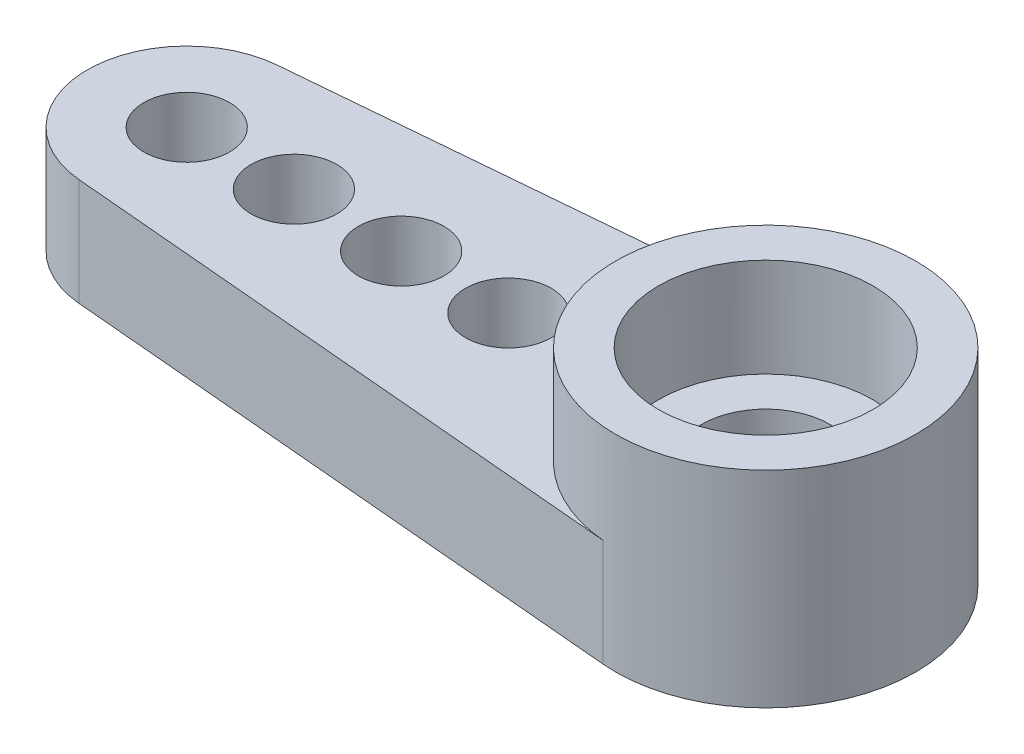
ISO-10303-21;
HEADER;
FILE_DESCRIPTION(('STEP AP214'),'2;1');
FILE_NAME('part.step','',(''),(''),'','','');
FILE_SCHEMA(('AUTOMOTIVE_DESIGN { 1 0 10303 214 1 1 1 1 }'));
ENDSEC;
DATA;
#1=APPLICATION_CONTEXT('core data for automotive mechanical design processes');
#2=APPLICATION_PROTOCOL_DEFINITION('international standard','automotive_design',2000,#1);
#3=PRODUCT_CONTEXT('',#1,'mechanical');
#4=PRODUCT('Part','Part','',(#3));
#5=PRODUCT_RELATED_PRODUCT_CATEGORY('part','',(#4));
#6=PRODUCT_DEFINITION_FORMATION('','',#4);
#7=PRODUCT_DEFINITION_CONTEXT('part definition',#1,'design');
#8=PRODUCT_DEFINITION('design','',#6,#7);
#9=PRODUCT_DEFINITION_SHAPE('','',#8);
#10=(LENGTH_UNIT() NAMED_UNIT(*) SI_UNIT(.MILLI.,.METRE.));
#11=(NAMED_UNIT(*) PLANE_ANGLE_UNIT() SI_UNIT($,.RADIAN.));
#12=(NAMED_UNIT(*) SI_UNIT($,.STERADIAN.) SOLID_ANGLE_UNIT());
#13=UNCERTAINTY_MEASURE_WITH_UNIT(LENGTH_MEASURE(1.E-05),#10,'distance_accuracy_value','');
#14=(GEOMETRIC_REPRESENTATION_CONTEXT(3) GLOBAL_UNCERTAINTY_ASSIGNED_CONTEXT((#13)) GLOBAL_UNIT_ASSIGNED_CONTEXT((#10,
#11,#12)) REPRESENTATION_CONTEXT('',''));
#15=CARTESIAN_POINT('',(0.,0.,0.));
#16=DIRECTION('',(0.,0.,1.));
#17=DIRECTION('',(1.,0.,0.));
#18=AXIS2_PLACEMENT_3D('',#15,#16,#17);
#19=CARTESIAN_POINT('',(0.,4.8,0.));
#20=DIRECTION('',(0.,-1.,0.));
#21=DIRECTION('',(0.,0.,-1.));
#22=AXIS2_PLACEMENT_3D('',#19,#20,#21);
#23=CYLINDRICAL_SURFACE('',#22,2.5);
#24=CARTESIAN_POINT('',(0.,4.8,0.));
#25=DIRECTION('',(0.,1.,0.));
#26=DIRECTION('',(0.,0.,1.));
#27=AXIS2_PLACEMENT_3D('',#24,#25,#26);
#28=CIRCLE('',#27,2.5);
#29=CARTESIAN_POINT('',(0.,4.8,2.5));
#30=VERTEX_POINT('',#29);
#31=EDGE_CURVE('E121',#30,#30,#28,.T.);
#32=ORIENTED_EDGE('',*,*,#31,.T.);
#33=EDGE_LOOP('',(#32));
#34=FACE_BOUND('',#33,.T.);
#35=CARTESIAN_POINT('',(0.,2.5,0.));
#36=DIRECTION('',(0.,-1.,0.));
#37=DIRECTION('',(0.,0.,-1.));
#38=AXIS2_PLACEMENT_3D('',#35,#36,#37);
#39=CIRCLE('',#38,2.5);
#40=CARTESIAN_POINT('',(0.,2.5,-2.5));
#41=VERTEX_POINT('',#40);
#42=EDGE_CURVE('E44',#41,#41,#39,.T.);
#43=ORIENTED_EDGE('',*,*,#42,.T.);
#44=EDGE_LOOP('',(#43));
#45=FACE_BOUND('',#44,.T.);
#46=ADVANCED_FACE('F40',(#34,#45),#23,.F.);
#47=CARTESIAN_POINT('',(0.,4.8,0.));
#48=DIRECTION('',(0.,1.,0.));
#49=DIRECTION('',(0.,0.,1.));
#50=AXIS2_PLACEMENT_3D('',#47,#48,#49);
#51=PLANE('',#50);
#52=CARTESIAN_POINT('',(0.,4.8,0.));
#53=DIRECTION('',(0.,1.,0.));
#54=DIRECTION('',(0.,0.,1.));
#55=AXIS2_PLACEMENT_3D('',#52,#53,#54);
#56=CIRCLE('',#55,3.5);
#57=CARTESIAN_POINT('',(0.,4.8,3.5));
#58=VERTEX_POINT('',#57);
#59=EDGE_CURVE('E11',#58,#58,#56,.T.);
#60=ORIENTED_EDGE('',*,*,#59,.T.);
#61=EDGE_LOOP('',(#60));
#62=FACE_BOUND('',#61,.T.);
#63=ORIENTED_EDGE('',*,*,#31,.F.);
#64=EDGE_LOOP('',(#63));
#65=FACE_BOUND('',#64,.T.);
#66=ADVANCED_FACE('F141',(#62,#65),#51,.T.);
#67=CARTESIAN_POINT('',(0.,0.,0.));
#68=DIRECTION('',(0.,1.,0.));
#69=DIRECTION('',(0.,0.,1.));
#70=AXIS2_PLACEMENT_3D('',#67,#68,#69);
#71=PLANE('',#70);
#72=CARTESIAN_POINT('',(0.,0.,0.));
#73=DIRECTION('',(0.,1.,0.));
#74=DIRECTION('',(0.,0.,1.));
#75=AXIS2_PLACEMENT_3D('',#72,#73,#74);
#76=CIRCLE('',#75,3.5);
#77=CARTESIAN_POINT('',(-0.305925925925926,0.,3.48660426889063));
#78=VERTEX_POINT('',#77);
#79=CARTESIAN_POINT('',(-0.305925925925926,0.,-3.48660426889063));
#80=VERTEX_POINT('',#79);
#81=EDGE_CURVE('E49',#78,#80,#76,.T.);
#82=ORIENTED_EDGE('',*,*,#81,.F.);
#83=DIRECTION('',(-0.996172648254466,0.,-0.0874074074074076));
#84=VECTOR('',#83,1.);
#85=CARTESIAN_POINT('',(-13.7027851851852,0.,2.31112054395036));
#86=LINE('',#85,#84);
#87=CARTESIAN_POINT('',(-13.7027851851852,0.,2.31112054395036));
#88=VERTEX_POINT('',#87);
#89=EDGE_CURVE('E103',#78,#88,#86,.T.);
#90=ORIENTED_EDGE('',*,*,#89,.T.);
#91=CARTESIAN_POINT('',(-13.5,0.,0.));
#92=DIRECTION('',(0.,-1.,0.));
#93=DIRECTION('',(0.,0.,-1.));
#94=AXIS2_PLACEMENT_3D('',#91,#92,#93);
#95=CIRCLE('',#94,2.32);
#96=CARTESIAN_POINT('',(-13.7027851851852,0.,-2.31112054395036));
#97=VERTEX_POINT('',#96);
#98=EDGE_CURVE('E112',#88,#97,#95,.T.);
#99=ORIENTED_EDGE('',*,*,#98,.T.);
#100=DIRECTION('',(0.996172648254466,0.,-0.0874074074074073));
#101=VECTOR('',#100,1.);
#102=CARTESIAN_POINT('',(-13.7027851851852,0.,-2.31112054395036));
#103=LINE('',#102,#101);
#104=EDGE_CURVE('E87',#97,#80,#103,.T.);
#105=ORIENTED_EDGE('',*,*,#104,.T.);
#106=EDGE_LOOP('',(#82,#90,#99,#105));
#107=FACE_BOUND('',#106,.T.);
#108=CARTESIAN_POINT('',(0.,0.,0.));
#109=DIRECTION('',(0.,-1.,0.));
#110=DIRECTION('',(0.,0.,-1.));
#111=AXIS2_PLACEMENT_3D('',#108,#109,#110);
#112=CIRCLE('',#111,1.5);
#113=CARTESIAN_POINT('',(0.,0.,-1.5));
#114=VERTEX_POINT('',#113);
#115=EDGE_CURVE('E108',#114,#114,#112,.T.);
#116=ORIENTED_EDGE('',*,*,#115,.F.);
#117=EDGE_LOOP('',(#116));
#118=FACE_BOUND('',#117,.T.);
#119=CARTESIAN_POINT('',(-6.,0.,0.));
#120=DIRECTION('',(0.,-1.,0.));
#121=DIRECTION('',(0.,0.,-1.));
#122=AXIS2_PLACEMENT_3D('',#119,#120,#121);
#123=CIRCLE('',#122,1.);
#124=CARTESIAN_POINT('',(-6.,0.,-1.));
#125=VERTEX_POINT('',#124);
#126=EDGE_CURVE('E205',#125,#125,#123,.T.);
#127=ORIENTED_EDGE('',*,*,#126,.F.);
#128=EDGE_LOOP('',(#127));
#129=FACE_BOUND('',#128,.T.);
#130=CARTESIAN_POINT('',(-8.5,0.,0.));
#131=DIRECTION('',(0.,-1.,0.));
#132=DIRECTION('',(0.,0.,-1.));
#133=AXIS2_PLACEMENT_3D('',#130,#131,#132);
#134=CIRCLE('',#133,1.);
#135=CARTESIAN_POINT('',(-8.5,0.,-1.));
#136=VERTEX_POINT('',#135);
#137=EDGE_CURVE('E209',#136,#136,#134,.T.);
#138=ORIENTED_EDGE('',*,*,#137,.F.);
#139=EDGE_LOOP('',(#138));
#140=FACE_BOUND('',#139,.T.);
#141=CARTESIAN_POINT('',(-11.,0.,0.));
#142=DIRECTION('',(0.,-1.,0.));
#143=DIRECTION('',(0.,0.,-1.));
#144=AXIS2_PLACEMENT_3D('',#141,#142,#143);
#145=CIRCLE('',#144,1.);
#146=CARTESIAN_POINT('',(-11.,0.,-1.));
#147=VERTEX_POINT('',#146);
#148=EDGE_CURVE('E196',#147,#147,#145,.T.);
#149=ORIENTED_EDGE('',*,*,#148,.F.);
#150=EDGE_LOOP('',(#149));
#151=FACE_BOUND('',#150,.T.);
#152=CARTESIAN_POINT('',(-13.5,0.,0.));
#153=DIRECTION('',(0.,-1.,0.));
#154=DIRECTION('',(0.,0.,-1.));
#155=AXIS2_PLACEMENT_3D('',#152,#153,#154);
#156=CIRCLE('',#155,1.);
#157=CARTESIAN_POINT('',(-13.5,0.,-1.));
#158=VERTEX_POINT('',#157);
#159=EDGE_CURVE('E190',#158,#158,#156,.T.);
#160=ORIENTED_EDGE('',*,*,#159,.F.);
#161=EDGE_LOOP('',(#160));
#162=FACE_BOUND('',#161,.T.);
#163=ADVANCED_FACE('F126',(#107,#118,#129,#140,#151,#162),#71,.F.);
#164=CARTESIAN_POINT('',(0.,4.8,0.));
#165=DIRECTION('',(0.,-1.,0.));
#166=DIRECTION('',(0.,0.,-1.));
#167=AXIS2_PLACEMENT_3D('',#164,#165,#166);
#168=CYLINDRICAL_SURFACE('',#167,3.5);
#169=DIRECTION('',(0.,-1.,0.));
#170=VECTOR('',#169,1.);
#171=CARTESIAN_POINT('',(-0.305925925925927,2.5,-3.48660426889063));
#172=LINE('',#171,#170);
#173=CARTESIAN_POINT('',(-0.305925925925927,2.5,-3.48660426889063));
#174=VERTEX_POINT('',#173);
#175=EDGE_CURVE('E62',#174,#80,#172,.T.);
#176=ORIENTED_EDGE('',*,*,#175,.F.);
#177=CARTESIAN_POINT('',(0.,2.5,0.));
#178=DIRECTION('',(0.,-1.,0.));
#179=DIRECTION('',(0.,0.,-1.));
#180=AXIS2_PLACEMENT_3D('',#177,#178,#179);
#181=CIRCLE('',#180,3.5);
#182=CARTESIAN_POINT('',(-0.305925925925926,2.5,3.48660426889063));
#183=VERTEX_POINT('',#182);
#184=EDGE_CURVE('E57',#183,#174,#181,.T.);
#185=ORIENTED_EDGE('',*,*,#184,.F.);
#186=DIRECTION('',(0.,-1.,0.));
#187=VECTOR('',#186,1.);
#188=CARTESIAN_POINT('',(-0.305925925925926,2.5,3.48660426889063));
#189=LINE('',#188,#187);
#190=EDGE_CURVE('E117',#183,#78,#189,.T.);
#191=ORIENTED_EDGE('',*,*,#190,.T.);
#192=ORIENTED_EDGE('',*,*,#81,.T.);
#193=EDGE_LOOP('',(#176,#185,#191,#192));
#194=FACE_BOUND('',#193,.T.);
#195=ORIENTED_EDGE('',*,*,#59,.F.);
#196=EDGE_LOOP('',(#195));
#197=FACE_BOUND('',#196,.T.);
#198=ADVANCED_FACE('F42',(#194,#197),#168,.T.);
#199=CARTESIAN_POINT('',(-13.5,2.5,0.));
#200=DIRECTION('',(0.,-1.,0.));
#201=DIRECTION('',(0.,0.,-1.));
#202=AXIS2_PLACEMENT_3D('',#199,#200,#201);
#203=PLANE('',#202);
#204=CARTESIAN_POINT('',(0.,2.5,0.));
#205=DIRECTION('',(0.,-1.,0.));
#206=DIRECTION('',(0.,0.,-1.));
#207=AXIS2_PLACEMENT_3D('',#204,#205,#206);
#208=CIRCLE('',#207,1.5);
#209=CARTESIAN_POINT('',(0.,2.5,-1.5));
#210=VERTEX_POINT('',#209);
#211=EDGE_CURVE('E114',#210,#210,#208,.T.);
#212=ORIENTED_EDGE('',*,*,#211,.T.);
#213=EDGE_LOOP('',(#212));
#214=FACE_BOUND('',#213,.T.);
#215=ORIENTED_EDGE('',*,*,#42,.F.);
#216=EDGE_LOOP('',(#215));
#217=FACE_BOUND('',#216,.T.);
#218=ADVANCED_FACE('F154',(#214,#217),#203,.F.);
#219=CARTESIAN_POINT('',(0.,2.5,0.));
#220=DIRECTION('',(0.,-1.,0.));
#221=DIRECTION('',(0.,0.,-1.));
#222=AXIS2_PLACEMENT_3D('',#219,#220,#221);
#223=CYLINDRICAL_SURFACE('',#222,1.5);
#224=ORIENTED_EDGE('',*,*,#211,.F.);
#225=EDGE_LOOP('',(#224));
#226=FACE_BOUND('',#225,.T.);
#227=ORIENTED_EDGE('',*,*,#115,.T.);
#228=EDGE_LOOP('',(#227));
#229=FACE_BOUND('',#228,.T.);
#230=ADVANCED_FACE('F137',(#226,#229),#223,.F.);
#231=CARTESIAN_POINT('',(-13.5,2.5,0.));
#232=DIRECTION('',(0.,-1.,0.));
#233=DIRECTION('',(0.,0.,-1.));
#234=AXIS2_PLACEMENT_3D('',#231,#232,#233);
#235=CYLINDRICAL_SURFACE('',#234,2.32);
#236=ORIENTED_EDGE('',*,*,#98,.F.);
#237=DIRECTION('',(0.,-1.,0.));
#238=VECTOR('',#237,1.);
#239=CARTESIAN_POINT('',(-13.7027851851852,2.5,2.31112054395036));
#240=LINE('',#239,#238);
#241=CARTESIAN_POINT('',(-13.7027851851852,2.5,2.31112054395036));
#242=VERTEX_POINT('',#241);
#243=EDGE_CURVE('E102',#242,#88,#240,.T.);
#244=ORIENTED_EDGE('',*,*,#243,.F.);
#245=CARTESIAN_POINT('',(-13.5,2.5,0.));
#246=DIRECTION('',(0.,-1.,0.));
#247=DIRECTION('',(0.,0.,-1.));
#248=AXIS2_PLACEMENT_3D('',#245,#246,#247);
#249=CIRCLE('',#248,2.32);
#250=CARTESIAN_POINT('',(-13.7027851851852,2.5,-2.31112054395036));
#251=VERTEX_POINT('',#250);
#252=EDGE_CURVE('E98',#242,#251,#249,.T.);
#253=ORIENTED_EDGE('',*,*,#252,.T.);
#254=DIRECTION('',(0.,-1.,0.));
#255=VECTOR('',#254,1.);
#256=CARTESIAN_POINT('',(-13.7027851851852,2.5,-2.31112054395036));
#257=LINE('',#256,#255);
#258=EDGE_CURVE('E82',#251,#97,#257,.T.);
#259=ORIENTED_EDGE('',*,*,#258,.T.);
#260=EDGE_LOOP('',(#236,#244,#253,#259));
#261=FACE_BOUND('',#260,.T.);
#262=ADVANCED_FACE('F101',(#261),#235,.T.);
#263=CARTESIAN_POINT('',(-13.7027851851852,2.5,2.31112054395036));
#264=DIRECTION('',(-0.0874074074074076,0.,0.996172648254466));
#265=DIRECTION('',(0.996172648254466,0.,0.0874074074074076));
#266=AXIS2_PLACEMENT_3D('',#263,#264,#265);
#267=PLANE('',#266);
#268=ORIENTED_EDGE('',*,*,#89,.F.);
#269=ORIENTED_EDGE('',*,*,#190,.F.);
#270=DIRECTION('',(-0.996172648254466,0.,-0.0874074074074076));
#271=VECTOR('',#270,1.);
#272=CARTESIAN_POINT('',(-13.7027851851852,2.5,2.31112054395036));
#273=LINE('',#272,#271);
#274=EDGE_CURVE('E92',#183,#242,#273,.T.);
#275=ORIENTED_EDGE('',*,*,#274,.T.);
#276=ORIENTED_EDGE('',*,*,#243,.T.);
#277=EDGE_LOOP('',(#268,#269,#275,#276));
#278=FACE_BOUND('',#277,.T.);
#279=ADVANCED_FACE('F129',(#278),#267,.T.);
#280=CARTESIAN_POINT('',(-13.7027851851852,2.5,-2.31112054395036));
#281=DIRECTION('',(-0.0874074074074073,0.,-0.996172648254466));
#282=DIRECTION('',(-0.996172648254466,0.,0.0874074074074073));
#283=AXIS2_PLACEMENT_3D('',#280,#281,#282);
#284=PLANE('',#283);
#285=ORIENTED_EDGE('',*,*,#104,.F.);
#286=ORIENTED_EDGE('',*,*,#258,.F.);
#287=DIRECTION('',(0.996172648254466,0.,-0.0874074074074073));
#288=VECTOR('',#287,1.);
#289=CARTESIAN_POINT('',(-13.7027851851852,2.5,-2.31112054395036));
#290=LINE('',#289,#288);
#291=EDGE_CURVE('E85',#251,#174,#290,.T.);
#292=ORIENTED_EDGE('',*,*,#291,.T.);
#293=ORIENTED_EDGE('',*,*,#175,.T.);
#294=EDGE_LOOP('',(#285,#286,#292,#293));
#295=FACE_BOUND('',#294,.T.);
#296=ADVANCED_FACE('F84',(#295),#284,.T.);
#297=CARTESIAN_POINT('',(-6.,2.5,0.));
#298=DIRECTION('',(0.,-1.,0.));
#299=DIRECTION('',(0.,0.,-1.));
#300=AXIS2_PLACEMENT_3D('',#297,#298,#299);
#301=CIRCLE('',#300,1.);
#302=CARTESIAN_POINT('',(-6.,2.5,-1.));
#303=VERTEX_POINT('',#302);
#304=EDGE_CURVE('E178',#303,#303,#301,.T.);
#305=ORIENTED_EDGE('',*,*,#304,.T.);
#306=EDGE_LOOP('',(#305));
#307=FACE_BOUND('',#306,.T.);
#308=CARTESIAN_POINT('',(-8.5,2.5,0.));
#309=DIRECTION('',(0.,-1.,0.));
#310=DIRECTION('',(0.,0.,-1.));
#311=AXIS2_PLACEMENT_3D('',#308,#309,#310);
#312=CIRCLE('',#311,1.);
#313=CARTESIAN_POINT('',(-8.5,2.5,-1.));
#314=VERTEX_POINT('',#313);
#315=EDGE_CURVE('E182',#314,#314,#312,.T.);
#316=ORIENTED_EDGE('',*,*,#315,.T.);
#317=EDGE_LOOP('',(#316));
#318=FACE_BOUND('',#317,.T.);
#319=CARTESIAN_POINT('',(-11.,2.5,0.));
#320=DIRECTION('',(0.,-1.,0.));
#321=DIRECTION('',(0.,0.,-1.));
#322=AXIS2_PLACEMENT_3D('',#319,#320,#321);
#323=CIRCLE('',#322,1.);
#324=CARTESIAN_POINT('',(-11.,2.5,-1.));
#325=VERTEX_POINT('',#324);
#326=EDGE_CURVE('E186',#325,#325,#323,.T.);
#327=ORIENTED_EDGE('',*,*,#326,.T.);
#328=EDGE_LOOP('',(#327));
#329=FACE_BOUND('',#328,.T.);
#330=CARTESIAN_POINT('',(-13.5,2.5,0.));
#331=DIRECTION('',(0.,-1.,0.));
#332=DIRECTION('',(0.,0.,-1.));
#333=AXIS2_PLACEMENT_3D('',#330,#331,#332);
#334=CIRCLE('',#333,1.);
#335=CARTESIAN_POINT('',(-13.5,2.5,-1.));
#336=VERTEX_POINT('',#335);
#337=EDGE_CURVE('E189',#336,#336,#334,.T.);
#338=ORIENTED_EDGE('',*,*,#337,.T.);
#339=EDGE_LOOP('',(#338));
#340=FACE_BOUND('',#339,.T.);
#341=ORIENTED_EDGE('',*,*,#274,.F.);
#342=ORIENTED_EDGE('',*,*,#184,.T.);
#343=ORIENTED_EDGE('',*,*,#291,.F.);
#344=ORIENTED_EDGE('',*,*,#252,.F.);
#345=EDGE_LOOP('',(#341,#342,#343,#344));
#346=FACE_BOUND('',#345,.T.);
#347=ADVANCED_FACE('F97',(#307,#318,#329,#340,#346),#203,.F.);
#348=CARTESIAN_POINT('',(-13.5,2.5,0.));
#349=DIRECTION('',(0.,-1.,0.));
#350=DIRECTION('',(0.,0.,-1.));
#351=AXIS2_PLACEMENT_3D('',#348,#349,#350);
#352=CYLINDRICAL_SURFACE('',#351,1.);
#353=ORIENTED_EDGE('',*,*,#337,.F.);
#354=EDGE_LOOP('',(#353));
#355=FACE_BOUND('',#354,.T.);
#356=ORIENTED_EDGE('',*,*,#159,.T.);
#357=EDGE_LOOP('',(#356));
#358=FACE_BOUND('',#357,.T.);
#359=ADVANCED_FACE('F167',(#355,#358),#352,.F.);
#360=CARTESIAN_POINT('',(-11.,2.5,0.));
#361=DIRECTION('',(0.,-1.,0.));
#362=DIRECTION('',(0.,0.,-1.));
#363=AXIS2_PLACEMENT_3D('',#360,#361,#362);
#364=CYLINDRICAL_SURFACE('',#363,1.);
#365=ORIENTED_EDGE('',*,*,#326,.F.);
#366=EDGE_LOOP('',(#365));
#367=FACE_BOUND('',#366,.T.);
#368=ORIENTED_EDGE('',*,*,#148,.T.);
#369=EDGE_LOOP('',(#368));
#370=FACE_BOUND('',#369,.T.);
#371=ADVANCED_FACE('F172',(#367,#370),#364,.F.);
#372=CARTESIAN_POINT('',(-8.5,2.5,0.));
#373=DIRECTION('',(0.,-1.,0.));
#374=DIRECTION('',(0.,0.,-1.));
#375=AXIS2_PLACEMENT_3D('',#372,#373,#374);
#376=CYLINDRICAL_SURFACE('',#375,1.);
#377=ORIENTED_EDGE('',*,*,#315,.F.);
#378=EDGE_LOOP('',(#377));
#379=FACE_BOUND('',#378,.T.);
#380=ORIENTED_EDGE('',*,*,#137,.T.);
#381=EDGE_LOOP('',(#380));
#382=FACE_BOUND('',#381,.T.);
#383=ADVANCED_FACE('F223',(#379,#382),#376,.F.);
#384=CARTESIAN_POINT('',(-6.,2.5,0.));
#385=DIRECTION('',(0.,-1.,0.));
#386=DIRECTION('',(0.,0.,-1.));
#387=AXIS2_PLACEMENT_3D('',#384,#385,#386);
#388=CYLINDRICAL_SURFACE('',#387,1.);
#389=ORIENTED_EDGE('',*,*,#304,.F.);
#390=EDGE_LOOP('',(#389));
#391=FACE_BOUND('',#390,.T.);
#392=ORIENTED_EDGE('',*,*,#126,.T.);
#393=EDGE_LOOP('',(#392));
#394=FACE_BOUND('',#393,.T.);
#395=ADVANCED_FACE('F221',(#391,#394),#388,.F.);
#396=CLOSED_SHELL('',(#46,#66,#163,#198,#218,#230,#262,#279,#296,#347,#359,#371,#383,#395));
#397=MANIFOLD_SOLID_BREP('B2',#396);
#398=ADVANCED_BREP_SHAPE_REPRESENTATION('',(#18,#397),#14);
#399=SHAPE_DEFINITION_REPRESENTATION(#9,#398);
ENDSEC;
END-ISO-10303-21;
